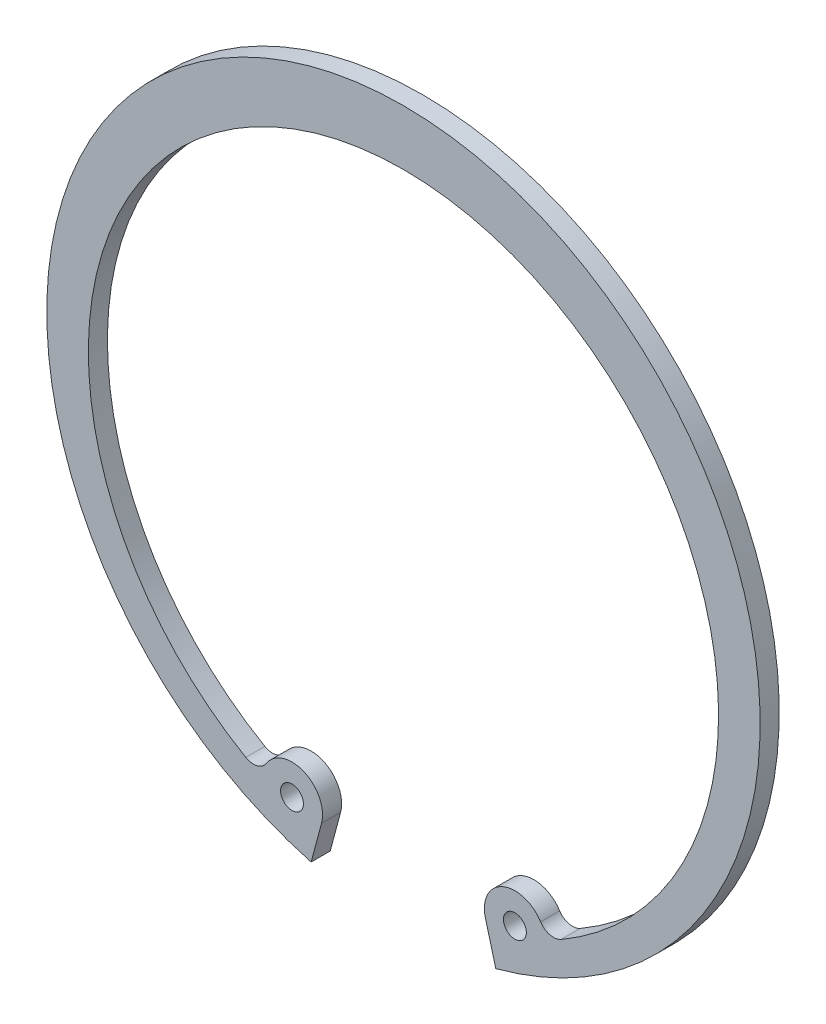
ISO-10303-21;
HEADER;
FILE_DESCRIPTION(('STEP AP214'),'2;1');
FILE_NAME('part.step','',(''),(''),'','','');
FILE_SCHEMA(('AUTOMOTIVE_DESIGN { 1 0 10303 214 1 1 1 1 }'));
ENDSEC;
DATA;
#1=APPLICATION_CONTEXT('core data for automotive mechanical design processes');
#2=APPLICATION_PROTOCOL_DEFINITION('international standard','automotive_design',2000,#1);
#3=PRODUCT_CONTEXT('',#1,'mechanical');
#4=PRODUCT('Part','Part','',(#3));
#5=PRODUCT_RELATED_PRODUCT_CATEGORY('part','',(#4));
#6=PRODUCT_DEFINITION_FORMATION('','',#4);
#7=PRODUCT_DEFINITION_CONTEXT('part definition',#1,'design');
#8=PRODUCT_DEFINITION('design','',#6,#7);
#9=PRODUCT_DEFINITION_SHAPE('','',#8);
#10=(LENGTH_UNIT() NAMED_UNIT(*) SI_UNIT(.MILLI.,.METRE.));
#11=(NAMED_UNIT(*) PLANE_ANGLE_UNIT() SI_UNIT($,.RADIAN.));
#12=(NAMED_UNIT(*) SI_UNIT($,.STERADIAN.) SOLID_ANGLE_UNIT());
#13=UNCERTAINTY_MEASURE_WITH_UNIT(LENGTH_MEASURE(1.E-05),#10,'distance_accuracy_value','');
#14=(GEOMETRIC_REPRESENTATION_CONTEXT(3) GLOBAL_UNCERTAINTY_ASSIGNED_CONTEXT((#13)) GLOBAL_UNIT_ASSIGNED_CONTEXT((#10,
#11,#12)) REPRESENTATION_CONTEXT('',''));
#15=CARTESIAN_POINT('',(0.,0.,0.));
#16=DIRECTION('',(0.,0.,1.));
#17=DIRECTION('',(1.,0.,0.));
#18=AXIS2_PLACEMENT_3D('',#15,#16,#17);
#19=CARTESIAN_POINT('',(0.,0.,-2.5));
#20=DIRECTION('',(0.,0.,1.));
#21=DIRECTION('',(1.,0.,0.));
#22=AXIS2_PLACEMENT_3D('',#19,#20,#21);
#23=CYLINDRICAL_SURFACE('',#22,46.75);
#24=CARTESIAN_POINT('',(0.,0.,0.));
#25=DIRECTION('',(0.,0.,1.));
#26=DIRECTION('',(1.,0.,0.));
#27=AXIS2_PLACEMENT_3D('',#24,#25,#26);
#28=CIRCLE('',#27,46.75);
#29=CARTESIAN_POINT('',(12.0997903585429,-45.1570323790139,0.));
#30=VERTEX_POINT('',#29);
#31=CARTESIAN_POINT('',(-12.0997903585429,-45.1570323790139,0.));
#32=VERTEX_POINT('',#31);
#33=EDGE_CURVE('E131',#30,#32,#28,.T.);
#34=ORIENTED_EDGE('',*,*,#33,.F.);
#35=DIRECTION('',(0.,0.,1.));
#36=VECTOR('',#35,1.);
#37=CARTESIAN_POINT('',(12.0997903585429,-45.1570323790139,-2.5));
#38=LINE('',#37,#36);
#39=CARTESIAN_POINT('',(12.0997903585429,-45.1570323790139,-2.5));
#40=VERTEX_POINT('',#39);
#41=EDGE_CURVE('E11',#40,#30,#38,.T.);
#42=ORIENTED_EDGE('',*,*,#41,.F.);
#43=CARTESIAN_POINT('',(0.,0.,-2.5));
#44=DIRECTION('',(0.,0.,1.));
#45=DIRECTION('',(1.,0.,0.));
#46=AXIS2_PLACEMENT_3D('',#43,#44,#45);
#47=CIRCLE('',#46,46.75);
#48=CARTESIAN_POINT('',(-12.0997903585429,-45.1570323790139,-2.5));
#49=VERTEX_POINT('',#48);
#50=EDGE_CURVE('E152',#40,#49,#47,.T.);
#51=ORIENTED_EDGE('',*,*,#50,.T.);
#52=DIRECTION('',(0.,0.,1.));
#53=VECTOR('',#52,1.);
#54=CARTESIAN_POINT('',(-12.0997903585429,-45.1570323790139,-2.5));
#55=LINE('',#54,#53);
#56=EDGE_CURVE('E37',#49,#32,#55,.T.);
#57=ORIENTED_EDGE('',*,*,#56,.T.);
#58=EDGE_LOOP('',(#34,#42,#51,#57));
#59=FACE_BOUND('',#58,.T.);
#60=ADVANCED_FACE('F34',(#59),#23,.T.);
#61=CARTESIAN_POINT('',(10.7429858995028,-40.0933692019402,-2.5));
#62=DIRECTION('',(-0.965925826289068,-0.258819045102522,0.));
#63=DIRECTION('',(0.258819045102522,-0.965925826289068,0.));
#64=AXIS2_PLACEMENT_3D('',#61,#62,#63);
#65=PLANE('',#64);
#66=DIRECTION('',(0.258819045102522,-0.965925826289068,0.));
#67=VECTOR('',#66,1.);
#68=CARTESIAN_POINT('',(10.7429858995028,-40.0933692019402,0.));
#69=LINE('',#68,#67);
#70=CARTESIAN_POINT('',(10.7429858995028,-40.0933692019402,0.));
#71=VERTEX_POINT('',#70);
#72=EDGE_CURVE('E150',#71,#30,#69,.T.);
#73=ORIENTED_EDGE('',*,*,#72,.F.);
#74=DIRECTION('',(0.,0.,1.));
#75=VECTOR('',#74,1.);
#76=CARTESIAN_POINT('',(10.7429858995028,-40.0933692019402,-2.5));
#77=LINE('',#76,#75);
#78=CARTESIAN_POINT('',(10.7429858995028,-40.0933692019402,-2.5));
#79=VERTEX_POINT('',#78);
#80=EDGE_CURVE('E43',#79,#71,#77,.T.);
#81=ORIENTED_EDGE('',*,*,#80,.F.);
#82=DIRECTION('',(0.258819045102522,-0.965925826289068,0.));
#83=VECTOR('',#82,1.);
#84=CARTESIAN_POINT('',(10.7429858995028,-40.0933692019402,-2.5));
#85=LINE('',#84,#83);
#86=EDGE_CURVE('E121',#79,#40,#85,.T.);
#87=ORIENTED_EDGE('',*,*,#86,.T.);
#88=ORIENTED_EDGE('',*,*,#41,.T.);
#89=EDGE_LOOP('',(#73,#81,#87,#88));
#90=FACE_BOUND('',#89,.T.);
#91=ADVANCED_FACE('F164',(#90),#65,.T.);
#92=CARTESIAN_POINT('',(14.606689204659,-39.0580930215301,-2.5));
#93=DIRECTION('',(0.,0.,1.));
#94=DIRECTION('',(1.,0.,0.));
#95=AXIS2_PLACEMENT_3D('',#92,#93,#94);
#96=CYLINDRICAL_SURFACE('',#95,4.);
#97=CARTESIAN_POINT('',(14.606689204659,-39.0580930215301,0.));
#98=DIRECTION('',(0.,0.,1.));
#99=DIRECTION('',(-1.,0.,0.));
#100=AXIS2_PLACEMENT_3D('',#97,#98,#99);
#101=CIRCLE('',#100,4.);
#102=CARTESIAN_POINT('',(17.9773526485061,-36.9043456017259,0.));
#103=VERTEX_POINT('',#102);
#104=EDGE_CURVE('E108',#103,#71,#101,.T.);
#105=ORIENTED_EDGE('',*,*,#104,.F.);
#106=DIRECTION('',(0.,0.,1.));
#107=VECTOR('',#106,1.);
#108=CARTESIAN_POINT('',(17.9773526485061,-36.9043456017259,-2.5));
#109=LINE('',#108,#107);
#110=CARTESIAN_POINT('',(17.9773526485061,-36.9043456017259,-2.5));
#111=VERTEX_POINT('',#110);
#112=EDGE_CURVE('E103',#111,#103,#109,.T.);
#113=ORIENTED_EDGE('',*,*,#112,.F.);
#114=CARTESIAN_POINT('',(14.606689204659,-39.0580930215301,-2.5));
#115=DIRECTION('',(0.,0.,1.));
#116=DIRECTION('',(-1.,0.,0.));
#117=AXIS2_PLACEMENT_3D('',#114,#115,#116);
#118=CIRCLE('',#117,4.);
#119=EDGE_CURVE('E106',#111,#79,#118,.T.);
#120=ORIENTED_EDGE('',*,*,#119,.T.);
#121=ORIENTED_EDGE('',*,*,#80,.T.);
#122=EDGE_LOOP('',(#105,#113,#120,#121));
#123=FACE_BOUND('',#122,.T.);
#124=ADVANCED_FACE('F105',(#123),#96,.T.);
#125=CARTESIAN_POINT('',(19.6626843704296,-35.8274718918239,-2.5));
#126=DIRECTION('',(0.,0.,1.));
#127=DIRECTION('',(1.,0.,0.));
#128=AXIS2_PLACEMENT_3D('',#125,#126,#127);
#129=CYLINDRICAL_SURFACE('',#128,2.);
#130=CARTESIAN_POINT('',(19.6626843704296,-35.8274718918239,0.));
#131=DIRECTION('',(0.,0.,-1.));
#132=DIRECTION('',(-1.,0.,0.));
#133=AXIS2_PLACEMENT_3D('',#130,#131,#132);
#134=CIRCLE('',#133,2.);
#135=CARTESIAN_POINT('',(20.6633298854642,-37.5591498506953,0.));
#136=VERTEX_POINT('',#135);
#137=EDGE_CURVE('E147',#136,#103,#134,.T.);
#138=ORIENTED_EDGE('',*,*,#137,.F.);
#139=DIRECTION('',(0.,0.,1.));
#140=VECTOR('',#139,1.);
#141=CARTESIAN_POINT('',(20.6633298854642,-37.5591498506953,-2.5));
#142=LINE('',#141,#140);
#143=CARTESIAN_POINT('',(20.6633298854642,-37.5591498506953,-2.5));
#144=VERTEX_POINT('',#143);
#145=EDGE_CURVE('E113',#144,#136,#142,.T.);
#146=ORIENTED_EDGE('',*,*,#145,.F.);
#147=CARTESIAN_POINT('',(19.6626843704296,-35.8274718918239,-2.5));
#148=DIRECTION('',(0.,0.,-1.));
#149=DIRECTION('',(-1.,0.,0.));
#150=AXIS2_PLACEMENT_3D('',#147,#148,#149);
#151=CIRCLE('',#150,2.);
#152=EDGE_CURVE('E119',#144,#111,#151,.T.);
#153=ORIENTED_EDGE('',*,*,#152,.T.);
#154=ORIENTED_EDGE('',*,*,#112,.T.);
#155=EDGE_LOOP('',(#138,#146,#153,#154));
#156=FACE_BOUND('',#155,.T.);
#157=ADVANCED_FACE('F123',(#156),#129,.F.);
#158=CARTESIAN_POINT('',(0.,-1.8,-2.5));
#159=DIRECTION('',(0.,0.,1.));
#160=DIRECTION('',(1.,0.,0.));
#161=AXIS2_PLACEMENT_3D('',#158,#159,#160);
#162=CYLINDRICAL_SURFACE('',#161,41.3);
#163=CARTESIAN_POINT('',(0.,-1.8,0.));
#164=DIRECTION('',(0.,0.,-1.));
#165=DIRECTION('',(1.,0.,0.));
#166=AXIS2_PLACEMENT_3D('',#163,#164,#165);
#167=CIRCLE('',#166,41.3);
#168=CARTESIAN_POINT('',(-20.6633298854642,-37.5591498506953,0.));
#169=VERTEX_POINT('',#168);
#170=EDGE_CURVE('E144',#169,#136,#167,.T.);
#171=ORIENTED_EDGE('',*,*,#170,.F.);
#172=DIRECTION('',(0.,0.,1.));
#173=VECTOR('',#172,1.);
#174=CARTESIAN_POINT('',(-20.6633298854642,-37.5591498506953,-2.5));
#175=LINE('',#174,#173);
#176=CARTESIAN_POINT('',(-20.6633298854642,-37.5591498506953,-2.5));
#177=VERTEX_POINT('',#176);
#178=EDGE_CURVE('E156',#177,#169,#175,.T.);
#179=ORIENTED_EDGE('',*,*,#178,.F.);
#180=CARTESIAN_POINT('',(0.,-1.8,-2.5));
#181=DIRECTION('',(0.,0.,-1.));
#182=DIRECTION('',(1.,0.,0.));
#183=AXIS2_PLACEMENT_3D('',#180,#181,#182);
#184=CIRCLE('',#183,41.3);
#185=EDGE_CURVE('E124',#177,#144,#184,.T.);
#186=ORIENTED_EDGE('',*,*,#185,.T.);
#187=ORIENTED_EDGE('',*,*,#145,.T.);
#188=EDGE_LOOP('',(#171,#179,#186,#187));
#189=FACE_BOUND('',#188,.T.);
#190=ADVANCED_FACE('F177',(#189),#162,.F.);
#191=CARTESIAN_POINT('',(-19.6626843704296,-35.8274718918239,-2.5));
#192=DIRECTION('',(0.,0.,1.));
#193=DIRECTION('',(1.,0.,0.));
#194=AXIS2_PLACEMENT_3D('',#191,#192,#193);
#195=CYLINDRICAL_SURFACE('',#194,2.);
#196=CARTESIAN_POINT('',(-19.6626843704296,-35.8274718918239,0.));
#197=DIRECTION('',(0.,0.,-1.));
#198=DIRECTION('',(1.,0.,0.));
#199=AXIS2_PLACEMENT_3D('',#196,#197,#198);
#200=CIRCLE('',#199,2.);
#201=CARTESIAN_POINT('',(-17.9773526485061,-36.904345601726,0.));
#202=VERTEX_POINT('',#201);
#203=EDGE_CURVE('E141',#202,#169,#200,.T.);
#204=ORIENTED_EDGE('',*,*,#203,.F.);
#205=DIRECTION('',(0.,0.,1.));
#206=VECTOR('',#205,1.);
#207=CARTESIAN_POINT('',(-17.9773526485061,-36.904345601726,-2.5));
#208=LINE('',#207,#206);
#209=CARTESIAN_POINT('',(-17.9773526485061,-36.904345601726,-2.5));
#210=VERTEX_POINT('',#209);
#211=EDGE_CURVE('E158',#210,#202,#208,.T.);
#212=ORIENTED_EDGE('',*,*,#211,.F.);
#213=CARTESIAN_POINT('',(-19.6626843704296,-35.8274718918239,-2.5));
#214=DIRECTION('',(0.,0.,-1.));
#215=DIRECTION('',(1.,0.,0.));
#216=AXIS2_PLACEMENT_3D('',#213,#214,#215);
#217=CIRCLE('',#216,2.);
#218=EDGE_CURVE('E126',#210,#177,#217,.T.);
#219=ORIENTED_EDGE('',*,*,#218,.T.);
#220=ORIENTED_EDGE('',*,*,#178,.T.);
#221=EDGE_LOOP('',(#204,#212,#219,#220));
#222=FACE_BOUND('',#221,.T.);
#223=ADVANCED_FACE('F180',(#222),#195,.F.);
#224=CARTESIAN_POINT('',(-14.606689204659,-39.0580930215301,-2.5));
#225=DIRECTION('',(0.,0.,1.));
#226=DIRECTION('',(1.,0.,0.));
#227=AXIS2_PLACEMENT_3D('',#224,#225,#226);
#228=CYLINDRICAL_SURFACE('',#227,4.);
#229=CARTESIAN_POINT('',(-14.606689204659,-39.0580930215301,0.));
#230=DIRECTION('',(0.,0.,1.));
#231=DIRECTION('',(1.,0.,0.));
#232=AXIS2_PLACEMENT_3D('',#229,#230,#231);
#233=CIRCLE('',#232,4.);
#234=CARTESIAN_POINT('',(-10.7429858995027,-40.0933692019402,0.));
#235=VERTEX_POINT('',#234);
#236=EDGE_CURVE('E138',#235,#202,#233,.T.);
#237=ORIENTED_EDGE('',*,*,#236,.F.);
#238=DIRECTION('',(0.,0.,1.));
#239=VECTOR('',#238,1.);
#240=CARTESIAN_POINT('',(-10.7429858995027,-40.0933692019402,-2.5));
#241=LINE('',#240,#239);
#242=CARTESIAN_POINT('',(-10.7429858995027,-40.0933692019402,-2.5));
#243=VERTEX_POINT('',#242);
#244=EDGE_CURVE('E159',#243,#235,#241,.T.);
#245=ORIENTED_EDGE('',*,*,#244,.F.);
#246=CARTESIAN_POINT('',(-14.606689204659,-39.0580930215301,-2.5));
#247=DIRECTION('',(0.,0.,1.));
#248=DIRECTION('',(1.,0.,0.));
#249=AXIS2_PLACEMENT_3D('',#246,#247,#248);
#250=CIRCLE('',#249,4.);
#251=EDGE_CURVE('E226',#243,#210,#250,.T.);
#252=ORIENTED_EDGE('',*,*,#251,.T.);
#253=ORIENTED_EDGE('',*,*,#211,.T.);
#254=EDGE_LOOP('',(#237,#245,#252,#253));
#255=FACE_BOUND('',#254,.T.);
#256=ADVANCED_FACE('F184',(#255),#228,.T.);
#257=CARTESIAN_POINT('',(-10.7429858995027,-40.0933692019402,-2.5));
#258=DIRECTION('',(0.965925826289068,-0.258819045102521,0.));
#259=DIRECTION('',(0.258819045102521,0.965925826289068,0.));
#260=AXIS2_PLACEMENT_3D('',#257,#258,#259);
#261=PLANE('',#260);
#262=DIRECTION('',(0.258819045102521,0.965925826289068,0.));
#263=VECTOR('',#262,1.);
#264=CARTESIAN_POINT('',(-10.7429858995027,-40.0933692019402,0.));
#265=LINE('',#264,#263);
#266=EDGE_CURVE('E134',#32,#235,#265,.T.);
#267=ORIENTED_EDGE('',*,*,#266,.F.);
#268=ORIENTED_EDGE('',*,*,#56,.F.);
#269=DIRECTION('',(0.258819045102521,0.965925826289068,0.));
#270=VECTOR('',#269,1.);
#271=CARTESIAN_POINT('',(-10.7429858995027,-40.0933692019402,-2.5));
#272=LINE('',#271,#270);
#273=EDGE_CURVE('E224',#49,#243,#272,.T.);
#274=ORIENTED_EDGE('',*,*,#273,.T.);
#275=ORIENTED_EDGE('',*,*,#244,.T.);
#276=EDGE_LOOP('',(#267,#268,#274,#275));
#277=FACE_BOUND('',#276,.T.);
#278=ADVANCED_FACE('F161',(#277),#261,.T.);
#279=CARTESIAN_POINT('',(0.,0.,-2.5));
#280=DIRECTION('',(0.,0.,1.));
#281=DIRECTION('',(1.,0.,0.));
#282=AXIS2_PLACEMENT_3D('',#279,#280,#281);
#283=PLANE('',#282);
#284=CARTESIAN_POINT('',(-14.606689204659,-39.0580930215301,-2.5));
#285=DIRECTION('',(0.,0.,1.));
#286=DIRECTION('',(1.,0.,0.));
#287=AXIS2_PLACEMENT_3D('',#284,#285,#286);
#288=CIRCLE('',#287,1.5);
#289=CARTESIAN_POINT('',(-13.106689204659,-39.0580930215301,-2.5));
#290=VERTEX_POINT('',#289);
#291=EDGE_CURVE('E211',#290,#290,#288,.T.);
#292=ORIENTED_EDGE('',*,*,#291,.T.);
#293=EDGE_LOOP('',(#292));
#294=FACE_BOUND('',#293,.T.);
#295=CARTESIAN_POINT('',(14.606689204659,-39.0580930215301,-2.5));
#296=DIRECTION('',(0.,0.,1.));
#297=DIRECTION('',(-1.,0.,0.));
#298=AXIS2_PLACEMENT_3D('',#295,#296,#297);
#299=CIRCLE('',#298,1.5);
#300=CARTESIAN_POINT('',(13.106689204659,-39.0580930215301,-2.5));
#301=VERTEX_POINT('',#300);
#302=EDGE_CURVE('E135',#301,#301,#299,.T.);
#303=ORIENTED_EDGE('',*,*,#302,.T.);
#304=EDGE_LOOP('',(#303));
#305=FACE_BOUND('',#304,.T.);
#306=ORIENTED_EDGE('',*,*,#50,.F.);
#307=ORIENTED_EDGE('',*,*,#86,.F.);
#308=ORIENTED_EDGE('',*,*,#119,.F.);
#309=ORIENTED_EDGE('',*,*,#152,.F.);
#310=ORIENTED_EDGE('',*,*,#185,.F.);
#311=ORIENTED_EDGE('',*,*,#218,.F.);
#312=ORIENTED_EDGE('',*,*,#251,.F.);
#313=ORIENTED_EDGE('',*,*,#273,.F.);
#314=EDGE_LOOP('',(#306,#307,#308,#309,#310,#311,#312,#313));
#315=FACE_BOUND('',#314,.T.);
#316=ADVANCED_FACE('F117',(#294,#305,#315),#283,.F.);
#317=CARTESIAN_POINT('',(0.,0.,0.));
#318=DIRECTION('',(0.,0.,1.));
#319=DIRECTION('',(1.,0.,0.));
#320=AXIS2_PLACEMENT_3D('',#317,#318,#319);
#321=PLANE('',#320);
#322=CARTESIAN_POINT('',(-14.606689204659,-39.0580930215301,0.));
#323=DIRECTION('',(0.,0.,1.));
#324=DIRECTION('',(1.,0.,0.));
#325=AXIS2_PLACEMENT_3D('',#322,#323,#324);
#326=CIRCLE('',#325,1.5);
#327=CARTESIAN_POINT('',(-13.106689204659,-39.0580930215301,0.));
#328=VERTEX_POINT('',#327);
#329=EDGE_CURVE('E214',#328,#328,#326,.T.);
#330=ORIENTED_EDGE('',*,*,#329,.F.);
#331=EDGE_LOOP('',(#330));
#332=FACE_BOUND('',#331,.T.);
#333=CARTESIAN_POINT('',(14.606689204659,-39.0580930215301,0.));
#334=DIRECTION('',(0.,0.,1.));
#335=DIRECTION('',(-1.,0.,0.));
#336=AXIS2_PLACEMENT_3D('',#333,#334,#335);
#337=CIRCLE('',#336,1.5);
#338=CARTESIAN_POINT('',(13.106689204659,-39.0580930215301,0.));
#339=VERTEX_POINT('',#338);
#340=EDGE_CURVE('E216',#339,#339,#337,.T.);
#341=ORIENTED_EDGE('',*,*,#340,.F.);
#342=EDGE_LOOP('',(#341));
#343=FACE_BOUND('',#342,.T.);
#344=ORIENTED_EDGE('',*,*,#33,.T.);
#345=ORIENTED_EDGE('',*,*,#266,.T.);
#346=ORIENTED_EDGE('',*,*,#236,.T.);
#347=ORIENTED_EDGE('',*,*,#203,.T.);
#348=ORIENTED_EDGE('',*,*,#170,.T.);
#349=ORIENTED_EDGE('',*,*,#137,.T.);
#350=ORIENTED_EDGE('',*,*,#104,.T.);
#351=ORIENTED_EDGE('',*,*,#72,.T.);
#352=EDGE_LOOP('',(#344,#345,#346,#347,#348,#349,#350,#351));
#353=FACE_BOUND('',#352,.T.);
#354=ADVANCED_FACE('F163',(#332,#343,#353),#321,.T.);
#355=CARTESIAN_POINT('',(14.606689204659,-39.0580930215301,-2.5));
#356=DIRECTION('',(0.,0.,1.));
#357=DIRECTION('',(1.,0.,0.));
#358=AXIS2_PLACEMENT_3D('',#355,#356,#357);
#359=CYLINDRICAL_SURFACE('',#358,1.5);
#360=ORIENTED_EDGE('',*,*,#302,.F.);
#361=EDGE_LOOP('',(#360));
#362=FACE_BOUND('',#361,.T.);
#363=ORIENTED_EDGE('',*,*,#340,.T.);
#364=EDGE_LOOP('',(#363));
#365=FACE_BOUND('',#364,.T.);
#366=ADVANCED_FACE('F196',(#362,#365),#359,.F.);
#367=CARTESIAN_POINT('',(-14.606689204659,-39.0580930215301,-2.5));
#368=DIRECTION('',(0.,0.,1.));
#369=DIRECTION('',(1.,0.,0.));
#370=AXIS2_PLACEMENT_3D('',#367,#368,#369);
#371=CYLINDRICAL_SURFACE('',#370,1.5);
#372=ORIENTED_EDGE('',*,*,#291,.F.);
#373=EDGE_LOOP('',(#372));
#374=FACE_BOUND('',#373,.T.);
#375=ORIENTED_EDGE('',*,*,#329,.T.);
#376=EDGE_LOOP('',(#375));
#377=FACE_BOUND('',#376,.T.);
#378=ADVANCED_FACE('F203',(#374,#377),#371,.F.);
#379=CLOSED_SHELL('',(#60,#91,#124,#157,#190,#223,#256,#278,#316,#354,#366,#378));
#380=MANIFOLD_SOLID_BREP('B2',#379);
#381=ADVANCED_BREP_SHAPE_REPRESENTATION('',(#18,#380),#14);
#382=SHAPE_DEFINITION_REPRESENTATION(#9,#381);
ENDSEC;
END-ISO-10303-21;
